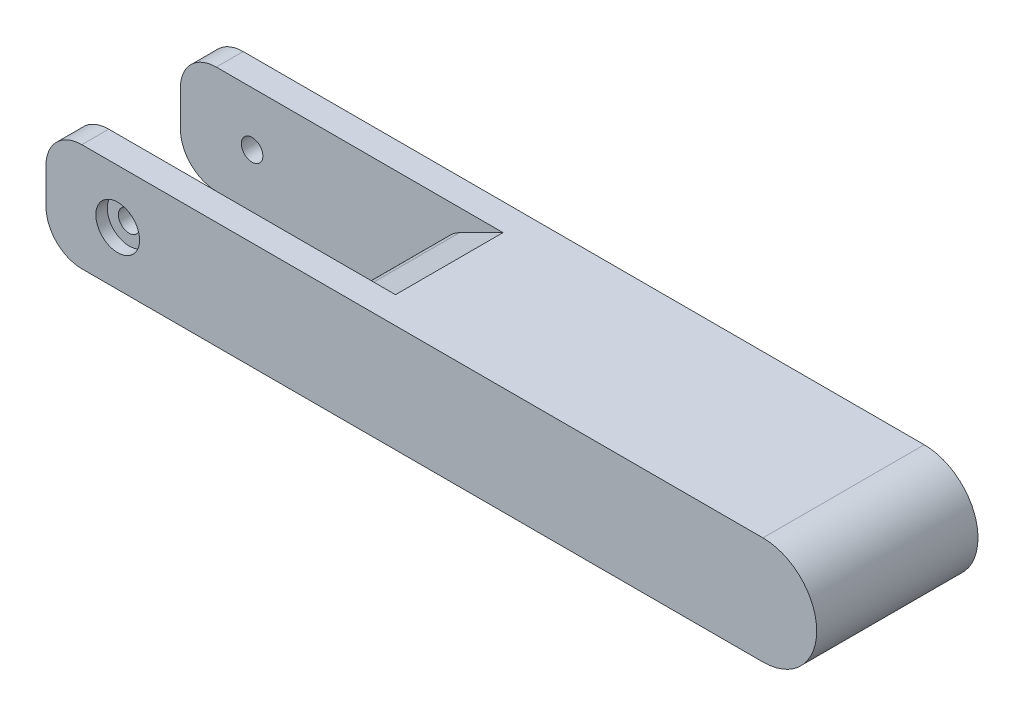
ISO-10303-21;
HEADER;
FILE_DESCRIPTION(('STEP AP214'),'2;1');
FILE_NAME('part.step','',(''),(''),'','','');
FILE_SCHEMA(('AUTOMOTIVE_DESIGN { 1 0 10303 214 1 1 1 1 }'));
ENDSEC;
DATA;
#1=APPLICATION_CONTEXT('core data for automotive mechanical design processes');
#2=APPLICATION_PROTOCOL_DEFINITION('international standard','automotive_design',2000,#1);
#3=PRODUCT_CONTEXT('',#1,'mechanical');
#4=PRODUCT('Part','Part','',(#3));
#5=PRODUCT_RELATED_PRODUCT_CATEGORY('part','',(#4));
#6=PRODUCT_DEFINITION_FORMATION('','',#4);
#7=PRODUCT_DEFINITION_CONTEXT('part definition',#1,'design');
#8=PRODUCT_DEFINITION('design','',#6,#7);
#9=PRODUCT_DEFINITION_SHAPE('','',#8);
#10=(LENGTH_UNIT() NAMED_UNIT(*) SI_UNIT(.MILLI.,.METRE.));
#11=(NAMED_UNIT(*) PLANE_ANGLE_UNIT() SI_UNIT($,.RADIAN.));
#12=(NAMED_UNIT(*) SI_UNIT($,.STERADIAN.) SOLID_ANGLE_UNIT());
#13=UNCERTAINTY_MEASURE_WITH_UNIT(LENGTH_MEASURE(1.E-05),#10,'distance_accuracy_value','');
#14=(GEOMETRIC_REPRESENTATION_CONTEXT(3) GLOBAL_UNCERTAINTY_ASSIGNED_CONTEXT((#13)) GLOBAL_UNIT_ASSIGNED_CONTEXT((#10,
#11,#12)) REPRESENTATION_CONTEXT('',''));
#15=CARTESIAN_POINT('',(0.,0.,0.));
#16=DIRECTION('',(0.,0.,1.));
#17=DIRECTION('',(1.,0.,0.));
#18=AXIS2_PLACEMENT_3D('',#15,#16,#17);
#19=CARTESIAN_POINT('',(-80.,0.,22.5));
#20=DIRECTION('',(0.,0.,-1.));
#21=DIRECTION('',(-1.,0.,0.));
#22=AXIS2_PLACEMENT_3D('',#19,#20,#21);
#23=CYLINDRICAL_SURFACE('',#22,3.00000000000001);
#24=CARTESIAN_POINT('',(-80.,0.,-15.));
#25=DIRECTION('',(0.,0.,-1.));
#26=DIRECTION('',(-1.,0.,0.));
#27=AXIS2_PLACEMENT_3D('',#24,#25,#26);
#28=CIRCLE('',#27,3.00000000000001);
#29=CARTESIAN_POINT('',(-83.,0.,-15.));
#30=VERTEX_POINT('',#29);
#31=EDGE_CURVE('E187',#30,#30,#28,.T.);
#32=CARTESIAN_POINT('',(-80.,0.,-19.3));
#33=DIRECTION('',(0.,0.,-1.));
#34=DIRECTION('',(-1.,0.,0.));
#35=AXIS2_PLACEMENT_3D('',#32,#33,#34);
#36=CIRCLE('',#35,3.00000000000001);
#37=CARTESIAN_POINT('',(-83.,0.,-19.3));
#38=VERTEX_POINT('',#37);
#39=EDGE_CURVE('E41',#38,#38,#36,.T.);
#40=CARTESIAN_POINT('',(-83.,0.,-15.));
#41=CARTESIAN_POINT('',(-83.,0.,-15.0447916666667));
#42=CARTESIAN_POINT('',(-83.,0.,-15.0895833333333));
#43=CARTESIAN_POINT('',(-83.,0.,-15.1791666666667));
#44=CARTESIAN_POINT('',(-83.,0.,-15.2239583333333));
#45=CARTESIAN_POINT('',(-83.,0.,-15.3135416666667));
#46=CARTESIAN_POINT('',(-83.,0.,-15.3583333333333));
#47=CARTESIAN_POINT('',(-83.,0.,-15.4479166666667));
#48=CARTESIAN_POINT('',(-83.,0.,-15.4927083333333));
#49=CARTESIAN_POINT('',(-83.,0.,-15.5822916666667));
#50=CARTESIAN_POINT('',(-83.,0.,-15.6270833333333));
#51=CARTESIAN_POINT('',(-83.,0.,-15.7166666666667));
#52=CARTESIAN_POINT('',(-83.,0.,-15.7614583333333));
#53=CARTESIAN_POINT('',(-83.,0.,-15.8510416666667));
#54=CARTESIAN_POINT('',(-83.,0.,-15.8958333333333));
#55=CARTESIAN_POINT('',(-83.,0.,-15.9854166666667));
#56=CARTESIAN_POINT('',(-83.,0.,-16.0302083333333));
#57=CARTESIAN_POINT('',(-83.,0.,-16.1197916666667));
#58=CARTESIAN_POINT('',(-83.,0.,-16.1645833333333));
#59=CARTESIAN_POINT('',(-83.,0.,-16.2541666666667));
#60=CARTESIAN_POINT('',(-83.,0.,-16.2989583333333));
#61=CARTESIAN_POINT('',(-83.,0.,-16.3885416666667));
#62=CARTESIAN_POINT('',(-83.,0.,-16.4333333333333));
#63=CARTESIAN_POINT('',(-83.,0.,-16.5229166666667));
#64=CARTESIAN_POINT('',(-83.,0.,-16.5677083333333));
#65=CARTESIAN_POINT('',(-83.,0.,-16.6572916666667));
#66=CARTESIAN_POINT('',(-83.,0.,-16.7020833333333));
#67=CARTESIAN_POINT('',(-83.,0.,-16.7916666666667));
#68=CARTESIAN_POINT('',(-83.,0.,-16.8364583333333));
#69=CARTESIAN_POINT('',(-83.,0.,-16.9260416666667));
#70=CARTESIAN_POINT('',(-83.,0.,-16.9708333333333));
#71=CARTESIAN_POINT('',(-83.,0.,-17.0604166666667));
#72=CARTESIAN_POINT('',(-83.,0.,-17.1052083333333));
#73=CARTESIAN_POINT('',(-83.,0.,-17.1947916666667));
#74=CARTESIAN_POINT('',(-83.,0.,-17.2395833333333));
#75=CARTESIAN_POINT('',(-83.,0.,-17.3291666666667));
#76=CARTESIAN_POINT('',(-83.,0.,-17.3739583333333));
#77=CARTESIAN_POINT('',(-83.,0.,-17.4635416666667));
#78=CARTESIAN_POINT('',(-83.,0.,-17.5083333333333));
#79=CARTESIAN_POINT('',(-83.,0.,-17.5979166666667));
#80=CARTESIAN_POINT('',(-83.,0.,-17.6427083333333));
#81=CARTESIAN_POINT('',(-83.,0.,-17.7322916666667));
#82=CARTESIAN_POINT('',(-83.,0.,-17.7770833333333));
#83=CARTESIAN_POINT('',(-83.,0.,-17.8666666666667));
#84=CARTESIAN_POINT('',(-83.,0.,-17.9114583333333));
#85=CARTESIAN_POINT('',(-83.,0.,-18.0010416666667));
#86=CARTESIAN_POINT('',(-83.,0.,-18.0458333333333));
#87=CARTESIAN_POINT('',(-83.,0.,-18.1354166666667));
#88=CARTESIAN_POINT('',(-83.,0.,-18.1802083333333));
#89=CARTESIAN_POINT('',(-83.,0.,-18.2697916666667));
#90=CARTESIAN_POINT('',(-83.,0.,-18.3145833333333));
#91=CARTESIAN_POINT('',(-83.,0.,-18.4041666666667));
#92=CARTESIAN_POINT('',(-83.,0.,-18.4489583333333));
#93=CARTESIAN_POINT('',(-83.,0.,-18.5385416666667));
#94=CARTESIAN_POINT('',(-83.,0.,-18.5833333333333));
#95=CARTESIAN_POINT('',(-83.,0.,-18.6729166666667));
#96=CARTESIAN_POINT('',(-83.,0.,-18.7177083333333));
#97=CARTESIAN_POINT('',(-83.,0.,-18.8072916666667));
#98=CARTESIAN_POINT('',(-83.,0.,-18.8520833333333));
#99=CARTESIAN_POINT('',(-83.,0.,-18.9416666666667));
#100=CARTESIAN_POINT('',(-83.,0.,-18.9864583333333));
#101=CARTESIAN_POINT('',(-83.,0.,-19.0760416666667));
#102=CARTESIAN_POINT('',(-83.,0.,-19.1208333333333));
#103=CARTESIAN_POINT('',(-83.,0.,-19.2104166666667));
#104=CARTESIAN_POINT('',(-83.,0.,-19.2552083333333));
#105=CARTESIAN_POINT('',(-83.,0.,-19.3));
#106=B_SPLINE_CURVE_WITH_KNOTS('',3,(#40,#41,#42,#43,#44,#45,#46,#47,#48,#49,#50,#51,#52,#53,
#54,#55,#56,#57,#58,#59,#60,#61,#62,#63,#64,#65,#66,#67,#68,#69,#70,#71,#72,#73,#74,#75,#76,#77,
#78,#79,#80,#81,#82,#83,#84,#85,#86,#87,#88,#89,#90,#91,#92,#93,#94,#95,#96,#97,#98,#99,#100,
#101,#102,#103,#104,#105),.UNSPECIFIED.,.F.,.F.,(4,2,2,2,2,2,2,2,2,2,2,2,2,2,2,2,2,2,2,2,2,2,2,
2,2,2,2,2,2,2,2,2,4),(0.,0.134374999999999,0.268749999999998,0.403124999999997,
0.537499999999996,0.671875000000002,0.806250000000001,0.940625,1.075,1.209375,1.34375,1.478125,
1.6125,1.746875,1.88125,2.015625,2.15,2.284375,2.41875,2.553125,2.6875,2.821875,2.95625,
3.090625,3.225,3.359375,3.49375,3.628125,3.7625,3.896875,4.03125,4.165625,4.3),.UNSPECIFIED.);
#107=EDGE_CURVE('BSEAM37',#30,#38,#106,.T.);
#108=ORIENTED_EDGE('',*,*,#31,.F.);
#109=ORIENTED_EDGE('',*,*,#39,.T.);
#110=ORIENTED_EDGE('',*,*,#107,.T.);
#111=ORIENTED_EDGE('',*,*,#107,.F.);
#112=EDGE_LOOP('',(#108,#110,#109,#111));
#113=FACE_BOUND('',#112,.T.);
#114=ADVANCED_FACE('F37',(#113),#23,.F.);
#115=CARTESIAN_POINT('',(-80.,0.,15.));
#116=DIRECTION('',(0.,0.,1.));
#117=DIRECTION('',(1.,0.,0.));
#118=AXIS2_PLACEMENT_3D('',#115,#116,#117);
#119=CIRCLE('',#118,3.00000000000001);
#120=CARTESIAN_POINT('',(-83.,0.,15.));
#121=VERTEX_POINT('',#120);
#122=EDGE_CURVE('E207',#121,#121,#119,.T.);
#123=CARTESIAN_POINT('',(-80.,0.,19.3));
#124=DIRECTION('',(0.,0.,1.));
#125=DIRECTION('',(1.,0.,0.));
#126=AXIS2_PLACEMENT_3D('',#123,#124,#125);
#127=CIRCLE('',#126,3.00000000000001);
#128=CARTESIAN_POINT('',(-83.,0.,19.3));
#129=VERTEX_POINT('',#128);
#130=EDGE_CURVE('E165',#129,#129,#127,.T.);
#131=CARTESIAN_POINT('',(-83.,0.,15.));
#132=CARTESIAN_POINT('',(-83.,0.,15.0447916666667));
#133=CARTESIAN_POINT('',(-83.,0.,15.0895833333333));
#134=CARTESIAN_POINT('',(-83.,0.,15.1791666666667));
#135=CARTESIAN_POINT('',(-83.,0.,15.2239583333333));
#136=CARTESIAN_POINT('',(-83.,0.,15.3135416666667));
#137=CARTESIAN_POINT('',(-83.,0.,15.3583333333333));
#138=CARTESIAN_POINT('',(-83.,0.,15.4479166666667));
#139=CARTESIAN_POINT('',(-83.,0.,15.4927083333333));
#140=CARTESIAN_POINT('',(-83.,0.,15.5822916666667));
#141=CARTESIAN_POINT('',(-83.,0.,15.6270833333333));
#142=CARTESIAN_POINT('',(-83.,0.,15.7166666666667));
#143=CARTESIAN_POINT('',(-83.,0.,15.7614583333333));
#144=CARTESIAN_POINT('',(-83.,0.,15.8510416666667));
#145=CARTESIAN_POINT('',(-83.,0.,15.8958333333333));
#146=CARTESIAN_POINT('',(-83.,0.,15.9854166666667));
#147=CARTESIAN_POINT('',(-83.,0.,16.0302083333333));
#148=CARTESIAN_POINT('',(-83.,0.,16.1197916666667));
#149=CARTESIAN_POINT('',(-83.,0.,16.1645833333333));
#150=CARTESIAN_POINT('',(-83.,0.,16.2541666666667));
#151=CARTESIAN_POINT('',(-83.,0.,16.2989583333333));
#152=CARTESIAN_POINT('',(-83.,0.,16.3885416666667));
#153=CARTESIAN_POINT('',(-83.,0.,16.4333333333333));
#154=CARTESIAN_POINT('',(-83.,0.,16.5229166666667));
#155=CARTESIAN_POINT('',(-83.,0.,16.5677083333333));
#156=CARTESIAN_POINT('',(-83.,0.,16.6572916666667));
#157=CARTESIAN_POINT('',(-83.,0.,16.7020833333333));
#158=CARTESIAN_POINT('',(-83.,0.,16.7916666666667));
#159=CARTESIAN_POINT('',(-83.,0.,16.8364583333333));
#160=CARTESIAN_POINT('',(-83.,0.,16.9260416666667));
#161=CARTESIAN_POINT('',(-83.,0.,16.9708333333333));
#162=CARTESIAN_POINT('',(-83.,0.,17.0604166666667));
#163=CARTESIAN_POINT('',(-83.,0.,17.1052083333333));
#164=CARTESIAN_POINT('',(-83.,0.,17.1947916666667));
#165=CARTESIAN_POINT('',(-83.,0.,17.2395833333333));
#166=CARTESIAN_POINT('',(-83.,0.,17.3291666666667));
#167=CARTESIAN_POINT('',(-83.,0.,17.3739583333333));
#168=CARTESIAN_POINT('',(-83.,0.,17.4635416666667));
#169=CARTESIAN_POINT('',(-83.,0.,17.5083333333333));
#170=CARTESIAN_POINT('',(-83.,0.,17.5979166666667));
#171=CARTESIAN_POINT('',(-83.,0.,17.6427083333333));
#172=CARTESIAN_POINT('',(-83.,0.,17.7322916666667));
#173=CARTESIAN_POINT('',(-83.,0.,17.7770833333333));
#174=CARTESIAN_POINT('',(-83.,0.,17.8666666666667));
#175=CARTESIAN_POINT('',(-83.,0.,17.9114583333333));
#176=CARTESIAN_POINT('',(-83.,0.,18.0010416666667));
#177=CARTESIAN_POINT('',(-83.,0.,18.0458333333333));
#178=CARTESIAN_POINT('',(-83.,0.,18.1354166666667));
#179=CARTESIAN_POINT('',(-83.,0.,18.1802083333333));
#180=CARTESIAN_POINT('',(-83.,0.,18.2697916666667));
#181=CARTESIAN_POINT('',(-83.,0.,18.3145833333333));
#182=CARTESIAN_POINT('',(-83.,0.,18.4041666666667));
#183=CARTESIAN_POINT('',(-83.,0.,18.4489583333333));
#184=CARTESIAN_POINT('',(-83.,0.,18.5385416666667));
#185=CARTESIAN_POINT('',(-83.,0.,18.5833333333333));
#186=CARTESIAN_POINT('',(-83.,0.,18.6729166666667));
#187=CARTESIAN_POINT('',(-83.,0.,18.7177083333333));
#188=CARTESIAN_POINT('',(-83.,0.,18.8072916666667));
#189=CARTESIAN_POINT('',(-83.,0.,18.8520833333333));
#190=CARTESIAN_POINT('',(-83.,0.,18.9416666666667));
#191=CARTESIAN_POINT('',(-83.,0.,18.9864583333333));
#192=CARTESIAN_POINT('',(-83.,0.,19.0760416666667));
#193=CARTESIAN_POINT('',(-83.,0.,19.1208333333333));
#194=CARTESIAN_POINT('',(-83.,0.,19.2104166666667));
#195=CARTESIAN_POINT('',(-83.,0.,19.2552083333333));
#196=CARTESIAN_POINT('',(-83.,0.,19.3));
#197=B_SPLINE_CURVE_WITH_KNOTS('',3,(#131,#132,#133,#134,#135,#136,#137,#138,#139,#140,#141,
#142,#143,#144,#145,#146,#147,#148,#149,#150,#151,#152,#153,#154,#155,#156,#157,#158,#159,#160,
#161,#162,#163,#164,#165,#166,#167,#168,#169,#170,#171,#172,#173,#174,#175,#176,#177,#178,#179,
#180,#181,#182,#183,#184,#185,#186,#187,#188,#189,#190,#191,#192,#193,#194,#195,#196),
.UNSPECIFIED.,.F.,.F.,(4,2,2,2,2,2,2,2,2,2,2,2,2,2,2,2,2,2,2,2,2,2,2,2,2,2,2,2,2,2,2,2,4),(0.,
0.134374999999999,0.268749999999998,0.403124999999999,0.5375,0.671874999999999,
0.806249999999998,0.940625,1.075,1.209375,1.34375,1.478125,1.6125,1.746875,1.88125,2.015625,
2.15,2.284375,2.41875,2.553125,2.6875,2.821875,2.95625,3.090625,3.225,3.359375,3.49375,3.628125,
3.76249999999999,3.896875,4.03125,4.165625,4.29999999999999),.UNSPECIFIED.);
#198=EDGE_CURVE('BSEAM291',#121,#129,#197,.T.);
#199=ORIENTED_EDGE('',*,*,#122,.F.);
#200=ORIENTED_EDGE('',*,*,#130,.T.);
#201=ORIENTED_EDGE('',*,*,#198,.T.);
#202=ORIENTED_EDGE('',*,*,#198,.F.);
#203=EDGE_LOOP('',(#199,#201,#200,#202));
#204=FACE_BOUND('',#203,.T.);
#205=ADVANCED_FACE('F291',(#204),#23,.F.);
#206=CARTESIAN_POINT('',(-100.,15.,22.5));
#207=DIRECTION('',(0.,-1.,0.));
#208=DIRECTION('',(0.,0.,-1.));
#209=AXIS2_PLACEMENT_3D('',#206,#207,#208);
#210=PLANE('',#209);
#211=DIRECTION('',(0.,0.,-1.));
#212=VECTOR('',#211,1.);
#213=CARTESIAN_POINT('',(-10.,15.,15.));
#214=LINE('',#213,#212);
#215=CARTESIAN_POINT('',(-10.,15.,15.));
#216=VERTEX_POINT('',#215);
#217=CARTESIAN_POINT('',(-10.,15.,-15.));
#218=VERTEX_POINT('',#217);
#219=EDGE_CURVE('E173',#216,#218,#214,.T.);
#220=ORIENTED_EDGE('',*,*,#219,.F.);
#221=DIRECTION('',(1.,0.,0.));
#222=VECTOR('',#221,1.);
#223=CARTESIAN_POINT('',(-100.,15.,15.));
#224=LINE('',#223,#222);
#225=CARTESIAN_POINT('',(-90.,15.,15.));
#226=VERTEX_POINT('',#225);
#227=EDGE_CURVE('E178',#226,#216,#224,.T.);
#228=ORIENTED_EDGE('',*,*,#227,.F.);
#229=DIRECTION('',(0.,0.,-1.));
#230=VECTOR('',#229,1.);
#231=CARTESIAN_POINT('',(-90.,15.,22.5));
#232=LINE('',#231,#230);
#233=CARTESIAN_POINT('',(-90.,15.,22.5));
#234=VERTEX_POINT('',#233);
#235=EDGE_CURVE('E255',#226,#234,#232,.F.);
#236=ORIENTED_EDGE('',*,*,#235,.T.);
#237=DIRECTION('',(-1.,0.,0.));
#238=VECTOR('',#237,1.);
#239=CARTESIAN_POINT('',(-100.,15.,22.5));
#240=LINE('',#239,#238);
#241=CARTESIAN_POINT('',(100.,15.,22.5));
#242=VERTEX_POINT('',#241);
#243=EDGE_CURVE('E193',#242,#234,#240,.T.);
#244=ORIENTED_EDGE('',*,*,#243,.F.);
#245=DIRECTION('',(0.,0.,-1.));
#246=VECTOR('',#245,1.);
#247=CARTESIAN_POINT('',(100.,15.,22.5));
#248=LINE('',#247,#246);
#249=CARTESIAN_POINT('',(100.,15.,-22.5));
#250=VERTEX_POINT('',#249);
#251=EDGE_CURVE('E216',#242,#250,#248,.T.);
#252=ORIENTED_EDGE('',*,*,#251,.T.);
#253=DIRECTION('',(-1.,0.,0.));
#254=VECTOR('',#253,1.);
#255=CARTESIAN_POINT('',(-100.,15.,-22.5));
#256=LINE('',#255,#254);
#257=CARTESIAN_POINT('',(-90.,15.,-22.5));
#258=VERTEX_POINT('',#257);
#259=EDGE_CURVE('E206',#250,#258,#256,.T.);
#260=ORIENTED_EDGE('',*,*,#259,.T.);
#261=DIRECTION('',(0.,0.,-1.));
#262=VECTOR('',#261,1.);
#263=CARTESIAN_POINT('',(-90.,15.,22.5));
#264=LINE('',#263,#262);
#265=CARTESIAN_POINT('',(-90.,15.,-15.));
#266=VERTEX_POINT('',#265);
#267=EDGE_CURVE('E253',#258,#266,#264,.F.);
#268=ORIENTED_EDGE('',*,*,#267,.T.);
#269=DIRECTION('',(-1.,0.,0.));
#270=VECTOR('',#269,1.);
#271=CARTESIAN_POINT('',(-100.,15.,-15.));
#272=LINE('',#271,#270);
#273=EDGE_CURVE('E177',#218,#266,#272,.T.);
#274=ORIENTED_EDGE('',*,*,#273,.F.);
#275=EDGE_LOOP('',(#220,#228,#236,#244,#252,#260,#268,#274));
#276=FACE_BOUND('',#275,.T.);
#277=ADVANCED_FACE('F297',(#276),#210,.F.);
#278=CARTESIAN_POINT('',(-100.,-15.,22.5));
#279=DIRECTION('',(1.,0.,0.));
#280=DIRECTION('',(0.,0.,-1.));
#281=AXIS2_PLACEMENT_3D('',#278,#279,#280);
#282=PLANE('',#281);
#283=DIRECTION('',(0.,1.,0.));
#284=VECTOR('',#283,1.);
#285=CARTESIAN_POINT('',(-100.,-15.,15.));
#286=LINE('',#285,#284);
#287=CARTESIAN_POINT('',(-100.,-5.,15.));
#288=VERTEX_POINT('',#287);
#289=CARTESIAN_POINT('',(-100.,5.,15.));
#290=VERTEX_POINT('',#289);
#291=EDGE_CURVE('E184',#288,#290,#286,.T.);
#292=ORIENTED_EDGE('',*,*,#291,.F.);
#293=DIRECTION('',(0.,0.,-1.));
#294=VECTOR('',#293,1.);
#295=CARTESIAN_POINT('',(-100.,-5.,22.5));
#296=LINE('',#295,#294);
#297=CARTESIAN_POINT('',(-100.,-5.,22.5));
#298=VERTEX_POINT('',#297);
#299=EDGE_CURVE('E234',#288,#298,#296,.F.);
#300=ORIENTED_EDGE('',*,*,#299,.T.);
#301=DIRECTION('',(0.,-1.,0.));
#302=VECTOR('',#301,1.);
#303=CARTESIAN_POINT('',(-100.,-15.,22.5));
#304=LINE('',#303,#302);
#305=CARTESIAN_POINT('',(-100.,5.,22.5));
#306=VERTEX_POINT('',#305);
#307=EDGE_CURVE('E197',#306,#298,#304,.T.);
#308=ORIENTED_EDGE('',*,*,#307,.F.);
#309=DIRECTION('',(0.,0.,-1.));
#310=VECTOR('',#309,1.);
#311=CARTESIAN_POINT('',(-100.,5.,22.5));
#312=LINE('',#311,#310);
#313=EDGE_CURVE('E231',#306,#290,#312,.T.);
#314=ORIENTED_EDGE('',*,*,#313,.T.);
#315=EDGE_LOOP('',(#292,#300,#308,#314));
#316=FACE_BOUND('',#315,.T.);
#317=ADVANCED_FACE('F308',(#316),#282,.F.);
#318=CARTESIAN_POINT('',(100.,0.,22.5));
#319=DIRECTION('',(0.,0.,1.));
#320=DIRECTION('',(1.,0.,0.));
#321=AXIS2_PLACEMENT_3D('',#318,#319,#320);
#322=PLANE('',#321);
#323=CARTESIAN_POINT('',(-80.,0.,22.5));
#324=DIRECTION('',(0.,0.,1.));
#325=DIRECTION('',(1.,0.,0.));
#326=AXIS2_PLACEMENT_3D('',#323,#324,#325);
#327=CIRCLE('',#326,6.1);
#328=CARTESIAN_POINT('',(-73.9,0.,22.5));
#329=VERTEX_POINT('',#328);
#330=EDGE_CURVE('E168',#329,#329,#327,.T.);
#331=ORIENTED_EDGE('',*,*,#330,.F.);
#332=EDGE_LOOP('',(#331));
#333=FACE_BOUND('',#332,.T.);
#334=ORIENTED_EDGE('',*,*,#307,.T.);
#335=CARTESIAN_POINT('',(-90.,-5.,22.5));
#336=DIRECTION('',(0.,0.,1.));
#337=DIRECTION('',(1.,0.,0.));
#338=AXIS2_PLACEMENT_3D('',#335,#336,#337);
#339=CIRCLE('',#338,10.);
#340=CARTESIAN_POINT('',(-90.,-15.,22.5));
#341=VERTEX_POINT('',#340);
#342=EDGE_CURVE('E238',#298,#341,#339,.T.);
#343=ORIENTED_EDGE('',*,*,#342,.T.);
#344=DIRECTION('',(1.,0.,0.));
#345=VECTOR('',#344,1.);
#346=CARTESIAN_POINT('',(-100.,-15.,22.5));
#347=LINE('',#346,#345);
#348=CARTESIAN_POINT('',(100.,-15.,22.5));
#349=VERTEX_POINT('',#348);
#350=EDGE_CURVE('E200',#341,#349,#347,.T.);
#351=ORIENTED_EDGE('',*,*,#350,.T.);
#352=CARTESIAN_POINT('',(100.,0.,22.5));
#353=DIRECTION('',(0.,0.,1.));
#354=DIRECTION('',(1.,0.,0.));
#355=AXIS2_PLACEMENT_3D('',#352,#353,#354);
#356=CIRCLE('',#355,15.);
#357=EDGE_CURVE('E190',#349,#242,#356,.T.);
#358=ORIENTED_EDGE('',*,*,#357,.T.);
#359=ORIENTED_EDGE('',*,*,#243,.T.);
#360=CARTESIAN_POINT('',(-90.,5.,22.5));
#361=DIRECTION('',(0.,0.,1.));
#362=DIRECTION('',(1.,0.,0.));
#363=AXIS2_PLACEMENT_3D('',#360,#361,#362);
#364=CIRCLE('',#363,10.);
#365=EDGE_CURVE('E236',#234,#306,#364,.T.);
#366=ORIENTED_EDGE('',*,*,#365,.T.);
#367=EDGE_LOOP('',(#334,#343,#351,#358,#359,#366));
#368=FACE_BOUND('',#367,.T.);
#369=ADVANCED_FACE('F304',(#333,#368),#322,.T.);
#370=CARTESIAN_POINT('',(100.,0.,-22.5));
#371=DIRECTION('',(0.,0.,1.));
#372=DIRECTION('',(1.,0.,0.));
#373=AXIS2_PLACEMENT_3D('',#370,#371,#372);
#374=PLANE('',#373);
#375=CARTESIAN_POINT('',(-80.,0.,-22.5));
#376=DIRECTION('',(0.,0.,-1.));
#377=DIRECTION('',(-1.,0.,0.));
#378=AXIS2_PLACEMENT_3D('',#375,#376,#377);
#379=CIRCLE('',#378,6.1);
#380=CARTESIAN_POINT('',(-86.1,0.,-22.5));
#381=VERTEX_POINT('',#380);
#382=EDGE_CURVE('E269',#381,#381,#379,.T.);
#383=ORIENTED_EDGE('',*,*,#382,.F.);
#384=EDGE_LOOP('',(#383));
#385=FACE_BOUND('',#384,.T.);
#386=DIRECTION('',(1.,0.,0.));
#387=VECTOR('',#386,1.);
#388=CARTESIAN_POINT('',(-100.,-15.,-22.5));
#389=LINE('',#388,#387);
#390=CARTESIAN_POINT('',(-90.,-15.,-22.5));
#391=VERTEX_POINT('',#390);
#392=CARTESIAN_POINT('',(100.,-15.,-22.5));
#393=VERTEX_POINT('',#392);
#394=EDGE_CURVE('E194',#391,#393,#389,.T.);
#395=ORIENTED_EDGE('',*,*,#394,.F.);
#396=CARTESIAN_POINT('',(-90.,-5.,-22.5));
#397=DIRECTION('',(0.,0.,1.));
#398=DIRECTION('',(1.,0.,0.));
#399=AXIS2_PLACEMENT_3D('',#396,#397,#398);
#400=CIRCLE('',#399,10.);
#401=CARTESIAN_POINT('',(-100.,-5.,-22.5));
#402=VERTEX_POINT('',#401);
#403=EDGE_CURVE('E242',#391,#402,#400,.F.);
#404=ORIENTED_EDGE('',*,*,#403,.T.);
#405=DIRECTION('',(0.,-1.,0.));
#406=VECTOR('',#405,1.);
#407=CARTESIAN_POINT('',(-100.,-15.,-22.5));
#408=LINE('',#407,#406);
#409=CARTESIAN_POINT('',(-100.,5.,-22.5));
#410=VERTEX_POINT('',#409);
#411=EDGE_CURVE('E210',#410,#402,#408,.T.);
#412=ORIENTED_EDGE('',*,*,#411,.F.);
#413=CARTESIAN_POINT('',(-90.,5.,-22.5));
#414=DIRECTION('',(0.,0.,1.));
#415=DIRECTION('',(1.,0.,0.));
#416=AXIS2_PLACEMENT_3D('',#413,#414,#415);
#417=CIRCLE('',#416,10.);
#418=EDGE_CURVE('E240',#410,#258,#417,.F.);
#419=ORIENTED_EDGE('',*,*,#418,.T.);
#420=ORIENTED_EDGE('',*,*,#259,.F.);
#421=CARTESIAN_POINT('',(100.,0.,-22.5));
#422=DIRECTION('',(0.,0.,1.));
#423=DIRECTION('',(1.,0.,0.));
#424=AXIS2_PLACEMENT_3D('',#421,#422,#423);
#425=CIRCLE('',#424,15.);
#426=EDGE_CURVE('E203',#393,#250,#425,.T.);
#427=ORIENTED_EDGE('',*,*,#426,.F.);
#428=EDGE_LOOP('',(#395,#404,#412,#419,#420,#427));
#429=FACE_BOUND('',#428,.T.);
#430=ADVANCED_FACE('F307',(#385,#429),#374,.F.);
#431=CARTESIAN_POINT('',(100.,0.,22.5));
#432=DIRECTION('',(0.,0.,-1.));
#433=DIRECTION('',(-1.,0.,0.));
#434=AXIS2_PLACEMENT_3D('',#431,#432,#433);
#435=CYLINDRICAL_SURFACE('',#434,15.);
#436=ORIENTED_EDGE('',*,*,#426,.T.);
#437=ORIENTED_EDGE('',*,*,#251,.F.);
#438=ORIENTED_EDGE('',*,*,#357,.F.);
#439=DIRECTION('',(0.,0.,-1.));
#440=VECTOR('',#439,1.);
#441=CARTESIAN_POINT('',(100.,-15.,22.5));
#442=LINE('',#441,#440);
#443=EDGE_CURVE('E202',#349,#393,#442,.T.);
#444=ORIENTED_EDGE('',*,*,#443,.T.);
#445=EDGE_LOOP('',(#436,#437,#438,#444));
#446=FACE_BOUND('',#445,.T.);
#447=ADVANCED_FACE('F312',(#446),#435,.T.);
#448=ORIENTED_EDGE('',*,*,#411,.T.);
#449=DIRECTION('',(0.,0.,-1.));
#450=VECTOR('',#449,1.);
#451=CARTESIAN_POINT('',(-100.,-5.,22.5));
#452=LINE('',#451,#450);
#453=CARTESIAN_POINT('',(-100.,-5.,-15.));
#454=VERTEX_POINT('',#453);
#455=EDGE_CURVE('E247',#402,#454,#452,.F.);
#456=ORIENTED_EDGE('',*,*,#455,.T.);
#457=DIRECTION('',(0.,1.,0.));
#458=VECTOR('',#457,1.);
#459=CARTESIAN_POINT('',(-100.,-15.,-15.));
#460=LINE('',#459,#458);
#461=CARTESIAN_POINT('',(-100.,5.,-15.));
#462=VERTEX_POINT('',#461);
#463=EDGE_CURVE('E149',#454,#462,#460,.T.);
#464=ORIENTED_EDGE('',*,*,#463,.T.);
#465=DIRECTION('',(0.,0.,-1.));
#466=VECTOR('',#465,1.);
#467=CARTESIAN_POINT('',(-100.,5.,22.5));
#468=LINE('',#467,#466);
#469=EDGE_CURVE('E244',#462,#410,#468,.T.);
#470=ORIENTED_EDGE('',*,*,#469,.T.);
#471=EDGE_LOOP('',(#448,#456,#464,#470));
#472=FACE_BOUND('',#471,.T.);
#473=ADVANCED_FACE('F316',(#472),#282,.F.);
#474=CARTESIAN_POINT('',(-100.,-15.,22.5));
#475=DIRECTION('',(0.,1.,0.));
#476=DIRECTION('',(0.,0.,1.));
#477=AXIS2_PLACEMENT_3D('',#474,#475,#476);
#478=PLANE('',#477);
#479=DIRECTION('',(1.,0.,0.));
#480=VECTOR('',#479,1.);
#481=CARTESIAN_POINT('',(-100.,-15.,15.));
#482=LINE('',#481,#480);
#483=CARTESIAN_POINT('',(-90.,-15.,15.));
#484=VERTEX_POINT('',#483);
#485=CARTESIAN_POINT('',(-9.99999999999999,-15.,15.));
#486=VERTEX_POINT('',#485);
#487=EDGE_CURVE('E139',#484,#486,#482,.T.);
#488=ORIENTED_EDGE('',*,*,#487,.T.);
#489=DIRECTION('',(0.,0.,-1.));
#490=VECTOR('',#489,1.);
#491=CARTESIAN_POINT('',(-9.99999999999999,-15.,15.));
#492=LINE('',#491,#490);
#493=CARTESIAN_POINT('',(-9.99999999999999,-15.,-15.));
#494=VERTEX_POINT('',#493);
#495=EDGE_CURVE('E143',#486,#494,#492,.T.);
#496=ORIENTED_EDGE('',*,*,#495,.T.);
#497=DIRECTION('',(-1.,0.,0.));
#498=VECTOR('',#497,1.);
#499=CARTESIAN_POINT('',(-100.,-15.,-15.));
#500=LINE('',#499,#498);
#501=CARTESIAN_POINT('',(-90.,-15.,-15.));
#502=VERTEX_POINT('',#501);
#503=EDGE_CURVE('E150',#494,#502,#500,.T.);
#504=ORIENTED_EDGE('',*,*,#503,.T.);
#505=DIRECTION('',(0.,0.,-1.));
#506=VECTOR('',#505,1.);
#507=CARTESIAN_POINT('',(-90.,-15.,22.5));
#508=LINE('',#507,#506);
#509=EDGE_CURVE('E219',#502,#391,#508,.T.);
#510=ORIENTED_EDGE('',*,*,#509,.T.);
#511=ORIENTED_EDGE('',*,*,#394,.T.);
#512=ORIENTED_EDGE('',*,*,#443,.F.);
#513=ORIENTED_EDGE('',*,*,#350,.F.);
#514=DIRECTION('',(0.,0.,-1.));
#515=VECTOR('',#514,1.);
#516=CARTESIAN_POINT('',(-90.,-15.,22.5));
#517=LINE('',#516,#515);
#518=EDGE_CURVE('E146',#341,#484,#517,.T.);
#519=ORIENTED_EDGE('',*,*,#518,.T.);
#520=EDGE_LOOP('',(#488,#496,#504,#510,#511,#512,#513,#519));
#521=FACE_BOUND('',#520,.T.);
#522=ADVANCED_FACE('F141',(#521),#478,.F.);
#523=CARTESIAN_POINT('',(-100.,-15.,15.));
#524=DIRECTION('',(0.,0.,1.));
#525=DIRECTION('',(1.,0.,0.));
#526=AXIS2_PLACEMENT_3D('',#523,#524,#525);
#527=PLANE('',#526);
#528=ORIENTED_EDGE('',*,*,#122,.T.);
#529=EDGE_LOOP('',(#528));
#530=FACE_BOUND('',#529,.T.);
#531=ORIENTED_EDGE('',*,*,#487,.F.);
#532=CARTESIAN_POINT('',(-90.,-5.,15.));
#533=DIRECTION('',(0.,0.,1.));
#534=DIRECTION('',(1.,0.,0.));
#535=AXIS2_PLACEMENT_3D('',#532,#533,#534);
#536=CIRCLE('',#535,10.);
#537=EDGE_CURVE('E229',#484,#288,#536,.F.);
#538=ORIENTED_EDGE('',*,*,#537,.T.);
#539=ORIENTED_EDGE('',*,*,#291,.T.);
#540=CARTESIAN_POINT('',(-90.,5.,15.));
#541=DIRECTION('',(0.,0.,1.));
#542=DIRECTION('',(1.,0.,0.));
#543=AXIS2_PLACEMENT_3D('',#540,#541,#542);
#544=CIRCLE('',#543,10.);
#545=EDGE_CURVE('E227',#290,#226,#544,.F.);
#546=ORIENTED_EDGE('',*,*,#545,.T.);
#547=ORIENTED_EDGE('',*,*,#227,.T.);
#548=DIRECTION('',(0.894427190999916,0.447213595499958,0.));
#549=VECTOR('',#548,1.);
#550=CARTESIAN_POINT('',(-40.,0.,15.));
#551=LINE('',#550,#549);
#552=CARTESIAN_POINT('',(-22.1114561800017,8.94427190999916,15.));
#553=VERTEX_POINT('',#552);
#554=EDGE_CURVE('E171',#553,#216,#551,.T.);
#555=ORIENTED_EDGE('',*,*,#554,.F.);
#556=CARTESIAN_POINT('',(-17.6393202250021,0.,15.));
#557=DIRECTION('',(0.,0.,1.));
#558=DIRECTION('',(1.,0.,0.));
#559=AXIS2_PLACEMENT_3D('',#556,#557,#558);
#560=CIRCLE('',#559,10.);
#561=CARTESIAN_POINT('',(-22.1114561800017,-8.94427190999916,15.));
#562=VERTEX_POINT('',#561);
#563=EDGE_CURVE('E11',#553,#562,#560,.T.);
#564=ORIENTED_EDGE('',*,*,#563,.T.);
#565=DIRECTION('',(-0.894427190999916,0.447213595499958,0.));
#566=VECTOR('',#565,1.);
#567=CARTESIAN_POINT('',(-9.99999999999999,-15.,15.));
#568=LINE('',#567,#566);
#569=EDGE_CURVE('E157',#486,#562,#568,.T.);
#570=ORIENTED_EDGE('',*,*,#569,.F.);
#571=EDGE_LOOP('',(#531,#538,#539,#546,#547,#555,#564,#570));
#572=FACE_BOUND('',#571,.T.);
#573=ADVANCED_FACE('F162',(#530,#572),#527,.F.);
#574=CARTESIAN_POINT('',(-100.,-15.,-15.));
#575=DIRECTION('',(0.,0.,-1.));
#576=DIRECTION('',(-1.,0.,0.));
#577=AXIS2_PLACEMENT_3D('',#574,#575,#576);
#578=PLANE('',#577);
#579=ORIENTED_EDGE('',*,*,#31,.T.);
#580=EDGE_LOOP('',(#579));
#581=FACE_BOUND('',#580,.T.);
#582=ORIENTED_EDGE('',*,*,#463,.F.);
#583=CARTESIAN_POINT('',(-90.,-5.,-15.));
#584=DIRECTION('',(0.,0.,-1.));
#585=DIRECTION('',(-1.,0.,0.));
#586=AXIS2_PLACEMENT_3D('',#583,#584,#585);
#587=CIRCLE('',#586,10.);
#588=EDGE_CURVE('E251',#454,#502,#587,.F.);
#589=ORIENTED_EDGE('',*,*,#588,.T.);
#590=ORIENTED_EDGE('',*,*,#503,.F.);
#591=DIRECTION('',(-0.894427190999916,0.447213595499958,0.));
#592=VECTOR('',#591,1.);
#593=CARTESIAN_POINT('',(-9.99999999999999,-15.,-15.));
#594=LINE('',#593,#592);
#595=CARTESIAN_POINT('',(-22.1114561800017,-8.94427190999916,-15.));
#596=VERTEX_POINT('',#595);
#597=EDGE_CURVE('E159',#494,#596,#594,.T.);
#598=ORIENTED_EDGE('',*,*,#597,.T.);
#599=CARTESIAN_POINT('',(-17.6393202250021,0.,-15.));
#600=DIRECTION('',(0.,0.,-1.));
#601=DIRECTION('',(-1.,0.,0.));
#602=AXIS2_PLACEMENT_3D('',#599,#600,#601);
#603=CIRCLE('',#602,10.);
#604=CARTESIAN_POINT('',(-22.1114561800017,8.94427190999916,-15.));
#605=VERTEX_POINT('',#604);
#606=EDGE_CURVE('E46',#596,#605,#603,.T.);
#607=ORIENTED_EDGE('',*,*,#606,.T.);
#608=DIRECTION('',(0.894427190999916,0.447213595499958,0.));
#609=VECTOR('',#608,1.);
#610=CARTESIAN_POINT('',(-40.,0.,-15.));
#611=LINE('',#610,#609);
#612=EDGE_CURVE('E160',#605,#218,#611,.T.);
#613=ORIENTED_EDGE('',*,*,#612,.T.);
#614=ORIENTED_EDGE('',*,*,#273,.T.);
#615=CARTESIAN_POINT('',(-90.,5.,-15.));
#616=DIRECTION('',(0.,0.,-1.));
#617=DIRECTION('',(-1.,0.,0.));
#618=AXIS2_PLACEMENT_3D('',#615,#616,#617);
#619=CIRCLE('',#618,10.);
#620=EDGE_CURVE('E249',#266,#462,#619,.F.);
#621=ORIENTED_EDGE('',*,*,#620,.T.);
#622=EDGE_LOOP('',(#582,#589,#590,#598,#607,#613,#614,#621));
#623=FACE_BOUND('',#622,.T.);
#624=ADVANCED_FACE('F302',(#581,#623),#578,.F.);
#625=CARTESIAN_POINT('',(-90.,-5.,22.5));
#626=DIRECTION('',(0.,0.,-1.));
#627=DIRECTION('',(-1.,0.,0.));
#628=AXIS2_PLACEMENT_3D('',#625,#626,#627);
#629=CYLINDRICAL_SURFACE('',#628,10.);
#630=ORIENTED_EDGE('',*,*,#342,.F.);
#631=ORIENTED_EDGE('',*,*,#299,.F.);
#632=ORIENTED_EDGE('',*,*,#537,.F.);
#633=ORIENTED_EDGE('',*,*,#518,.F.);
#634=EDGE_LOOP('',(#630,#631,#632,#633));
#635=FACE_BOUND('',#634,.T.);
#636=ADVANCED_FACE('F326',(#635),#629,.T.);
#637=CARTESIAN_POINT('',(-90.,-5.,22.5));
#638=DIRECTION('',(0.,0.,-1.));
#639=DIRECTION('',(-1.,0.,0.));
#640=AXIS2_PLACEMENT_3D('',#637,#638,#639);
#641=CYLINDRICAL_SURFACE('',#640,10.);
#642=ORIENTED_EDGE('',*,*,#588,.F.);
#643=ORIENTED_EDGE('',*,*,#455,.F.);
#644=ORIENTED_EDGE('',*,*,#403,.F.);
#645=ORIENTED_EDGE('',*,*,#509,.F.);
#646=EDGE_LOOP('',(#642,#643,#644,#645));
#647=FACE_BOUND('',#646,.T.);
#648=ADVANCED_FACE('F329',(#647),#641,.T.);
#649=CARTESIAN_POINT('',(-90.,5.,22.5));
#650=DIRECTION('',(0.,0.,-1.));
#651=DIRECTION('',(-1.,0.,0.));
#652=AXIS2_PLACEMENT_3D('',#649,#650,#651);
#653=CYLINDRICAL_SURFACE('',#652,10.);
#654=ORIENTED_EDGE('',*,*,#365,.F.);
#655=ORIENTED_EDGE('',*,*,#235,.F.);
#656=ORIENTED_EDGE('',*,*,#545,.F.);
#657=ORIENTED_EDGE('',*,*,#313,.F.);
#658=EDGE_LOOP('',(#654,#655,#656,#657));
#659=FACE_BOUND('',#658,.T.);
#660=ADVANCED_FACE('F333',(#659),#653,.T.);
#661=CARTESIAN_POINT('',(-90.,5.,22.5));
#662=DIRECTION('',(0.,0.,-1.));
#663=DIRECTION('',(-1.,0.,0.));
#664=AXIS2_PLACEMENT_3D('',#661,#662,#663);
#665=CYLINDRICAL_SURFACE('',#664,10.);
#666=ORIENTED_EDGE('',*,*,#620,.F.);
#667=ORIENTED_EDGE('',*,*,#267,.F.);
#668=ORIENTED_EDGE('',*,*,#418,.F.);
#669=ORIENTED_EDGE('',*,*,#469,.F.);
#670=EDGE_LOOP('',(#666,#667,#668,#669));
#671=FACE_BOUND('',#670,.T.);
#672=ADVANCED_FACE('F336',(#671),#665,.T.);
#673=CARTESIAN_POINT('',(-40.,0.,15.));
#674=DIRECTION('',(-0.447213595499958,0.894427190999916,0.));
#675=DIRECTION('',(-0.894427190999916,-0.447213595499958,0.));
#676=AXIS2_PLACEMENT_3D('',#673,#674,#675);
#677=PLANE('',#676);
#678=ORIENTED_EDGE('',*,*,#612,.F.);
#679=DIRECTION('',(0.,0.,-1.));
#680=VECTOR('',#679,1.);
#681=CARTESIAN_POINT('',(-22.1114561800017,8.94427190999916,15.));
#682=LINE('',#681,#680);
#683=EDGE_CURVE('E54',#605,#553,#682,.F.);
#684=ORIENTED_EDGE('',*,*,#683,.T.);
#685=ORIENTED_EDGE('',*,*,#554,.T.);
#686=ORIENTED_EDGE('',*,*,#219,.T.);
#687=EDGE_LOOP('',(#678,#684,#685,#686));
#688=FACE_BOUND('',#687,.T.);
#689=ADVANCED_FACE('F339',(#688),#677,.T.);
#690=CARTESIAN_POINT('',(-9.99999999999999,-15.,15.));
#691=DIRECTION('',(-0.447213595499958,-0.894427190999916,0.));
#692=DIRECTION('',(0.894427190999916,-0.447213595499958,0.));
#693=AXIS2_PLACEMENT_3D('',#690,#691,#692);
#694=PLANE('',#693);
#695=ORIENTED_EDGE('',*,*,#569,.T.);
#696=DIRECTION('',(0.,0.,-1.));
#697=VECTOR('',#696,1.);
#698=CARTESIAN_POINT('',(-22.1114561800017,-8.94427190999916,15.));
#699=LINE('',#698,#697);
#700=EDGE_CURVE('E257',#562,#596,#699,.T.);
#701=ORIENTED_EDGE('',*,*,#700,.T.);
#702=ORIENTED_EDGE('',*,*,#597,.F.);
#703=ORIENTED_EDGE('',*,*,#495,.F.);
#704=EDGE_LOOP('',(#695,#701,#702,#703));
#705=FACE_BOUND('',#704,.T.);
#706=ADVANCED_FACE('F155',(#705),#694,.T.);
#707=CARTESIAN_POINT('',(-17.6393202250021,0.,15.));
#708=DIRECTION('',(0.,0.,-1.));
#709=DIRECTION('',(-1.,0.,0.));
#710=AXIS2_PLACEMENT_3D('',#707,#708,#709);
#711=CYLINDRICAL_SURFACE('',#710,10.);
#712=ORIENTED_EDGE('',*,*,#563,.F.);
#713=ORIENTED_EDGE('',*,*,#683,.F.);
#714=ORIENTED_EDGE('',*,*,#606,.F.);
#715=ORIENTED_EDGE('',*,*,#700,.F.);
#716=EDGE_LOOP('',(#712,#713,#714,#715));
#717=FACE_BOUND('',#716,.T.);
#718=ADVANCED_FACE('F39',(#717),#711,.T.);
#719=CARTESIAN_POINT('',(-80.,0.,19.3));
#720=DIRECTION('',(0.,0.,1.));
#721=DIRECTION('',(1.,0.,0.));
#722=AXIS2_PLACEMENT_3D('',#719,#720,#721);
#723=CYLINDRICAL_SURFACE('',#722,6.1);
#724=CARTESIAN_POINT('',(-80.,0.,19.3));
#725=DIRECTION('',(0.,0.,1.));
#726=DIRECTION('',(1.,0.,0.));
#727=AXIS2_PLACEMENT_3D('',#724,#725,#726);
#728=CIRCLE('',#727,6.1);
#729=CARTESIAN_POINT('',(-73.9,0.,19.3));
#730=VERTEX_POINT('',#729);
#731=EDGE_CURVE('E261',#730,#730,#728,.T.);
#732=ORIENTED_EDGE('',*,*,#731,.F.);
#733=EDGE_LOOP('',(#732));
#734=FACE_BOUND('',#733,.T.);
#735=ORIENTED_EDGE('',*,*,#330,.T.);
#736=EDGE_LOOP('',(#735));
#737=FACE_BOUND('',#736,.T.);
#738=ADVANCED_FACE('F373',(#734,#737),#723,.F.);
#739=CARTESIAN_POINT('',(-80.,0.,19.3));
#740=DIRECTION('',(0.,0.,1.));
#741=DIRECTION('',(1.,0.,0.));
#742=AXIS2_PLACEMENT_3D('',#739,#740,#741);
#743=PLANE('',#742);
#744=ORIENTED_EDGE('',*,*,#130,.F.);
#745=EDGE_LOOP('',(#744));
#746=FACE_BOUND('',#745,.T.);
#747=ORIENTED_EDGE('',*,*,#731,.T.);
#748=EDGE_LOOP('',(#747));
#749=FACE_BOUND('',#748,.T.);
#750=ADVANCED_FACE('F287',(#746,#749),#743,.T.);
#751=CARTESIAN_POINT('',(-80.,0.,-19.3));
#752=DIRECTION('',(0.,0.,-1.));
#753=DIRECTION('',(-1.,0.,0.));
#754=AXIS2_PLACEMENT_3D('',#751,#752,#753);
#755=CYLINDRICAL_SURFACE('',#754,6.1);
#756=CARTESIAN_POINT('',(-80.,0.,-19.3));
#757=DIRECTION('',(0.,0.,-1.));
#758=DIRECTION('',(-1.,0.,0.));
#759=AXIS2_PLACEMENT_3D('',#756,#757,#758);
#760=CIRCLE('',#759,6.1);
#761=CARTESIAN_POINT('',(-86.1,0.,-19.3));
#762=VERTEX_POINT('',#761);
#763=EDGE_CURVE('E272',#762,#762,#760,.T.);
#764=ORIENTED_EDGE('',*,*,#763,.F.);
#765=EDGE_LOOP('',(#764));
#766=FACE_BOUND('',#765,.T.);
#767=ORIENTED_EDGE('',*,*,#382,.T.);
#768=EDGE_LOOP('',(#767));
#769=FACE_BOUND('',#768,.T.);
#770=ADVANCED_FACE('F282',(#766,#769),#755,.F.);
#771=CARTESIAN_POINT('',(-80.,0.,-19.3));
#772=DIRECTION('',(0.,0.,-1.));
#773=DIRECTION('',(-1.,0.,0.));
#774=AXIS2_PLACEMENT_3D('',#771,#772,#773);
#775=PLANE('',#774);
#776=ORIENTED_EDGE('',*,*,#39,.F.);
#777=EDGE_LOOP('',(#776));
#778=FACE_BOUND('',#777,.T.);
#779=ORIENTED_EDGE('',*,*,#763,.T.);
#780=EDGE_LOOP('',(#779));
#781=FACE_BOUND('',#780,.T.);
#782=ADVANCED_FACE('F280',(#778,#781),#775,.T.);
#783=CLOSED_SHELL('',(#114,#205,#277,#317,#369,#430,#447,#473,#522,#573,#624,#636,#648,#660,
#672,#689,#706,#718,#738,#750,#770,#782));
#784=MANIFOLD_SOLID_BREP('B2',#783);
#785=ADVANCED_BREP_SHAPE_REPRESENTATION('',(#18,#784),#14);
#786=SHAPE_DEFINITION_REPRESENTATION(#9,#785);
ENDSEC;
END-ISO-10303-21;
